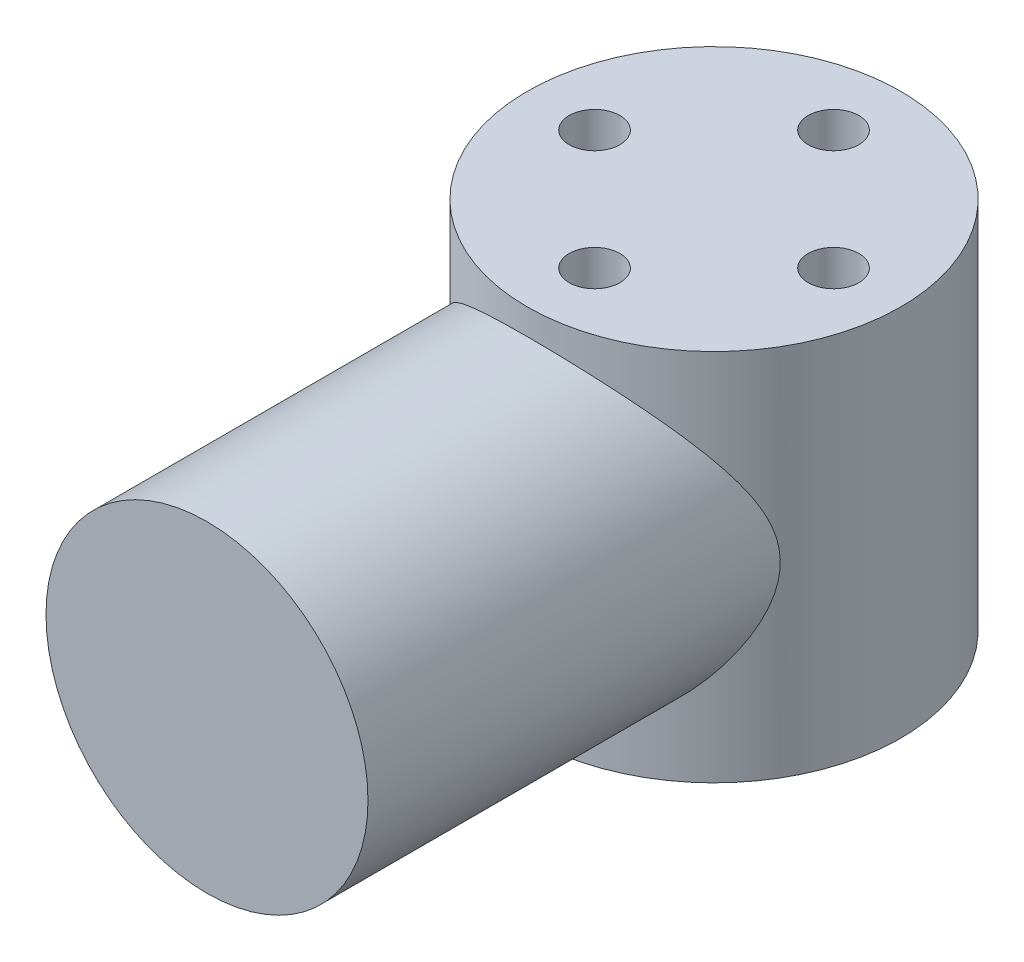
ISO-10303-21;
HEADER;
FILE_DESCRIPTION(('STEP AP214'),'2;1');
FILE_NAME('part.step','',(''),(''),'','','');
FILE_SCHEMA(('AUTOMOTIVE_DESIGN { 1 0 10303 214 1 1 1 1 }'));
ENDSEC;
DATA;
#1=APPLICATION_CONTEXT('core data for automotive mechanical design processes');
#2=APPLICATION_PROTOCOL_DEFINITION('international standard','automotive_design',2000,#1);
#3=PRODUCT_CONTEXT('',#1,'mechanical');
#4=PRODUCT('Part','Part','',(#3));
#5=PRODUCT_RELATED_PRODUCT_CATEGORY('part','',(#4));
#6=PRODUCT_DEFINITION_FORMATION('','',#4);
#7=PRODUCT_DEFINITION_CONTEXT('part definition',#1,'design');
#8=PRODUCT_DEFINITION('design','',#6,#7);
#9=PRODUCT_DEFINITION_SHAPE('','',#8);
#10=(LENGTH_UNIT() NAMED_UNIT(*) SI_UNIT(.MILLI.,.METRE.));
#11=(NAMED_UNIT(*) PLANE_ANGLE_UNIT() SI_UNIT($,.RADIAN.));
#12=(NAMED_UNIT(*) SI_UNIT($,.STERADIAN.) SOLID_ANGLE_UNIT());
#13=UNCERTAINTY_MEASURE_WITH_UNIT(LENGTH_MEASURE(1.E-05),#10,'distance_accuracy_value','');
#14=(GEOMETRIC_REPRESENTATION_CONTEXT(3) GLOBAL_UNCERTAINTY_ASSIGNED_CONTEXT((#13)) GLOBAL_UNIT_ASSIGNED_CONTEXT((#10,
#11,#12)) REPRESENTATION_CONTEXT('',''));
#15=CARTESIAN_POINT('',(0.,0.,0.));
#16=DIRECTION('',(0.,0.,1.));
#17=DIRECTION('',(1.,0.,0.));
#18=AXIS2_PLACEMENT_3D('',#15,#16,#17);
#19=CARTESIAN_POINT('',(0.,0.,0.));
#20=DIRECTION('',(0.,1.,0.));
#21=DIRECTION('',(0.,0.,1.));
#22=AXIS2_PLACEMENT_3D('',#19,#20,#21);
#23=PLANE('',#22);
#24=CARTESIAN_POINT('',(-7.07,0.,0.));
#25=DIRECTION('',(0.,-1.,0.));
#26=DIRECTION('',(0.,0.,-1.));
#27=AXIS2_PLACEMENT_3D('',#24,#25,#26);
#28=CIRCLE('',#27,1.5);
#29=CARTESIAN_POINT('',(-7.07,0.,-1.5));
#30=VERTEX_POINT('',#29);
#31=EDGE_CURVE('E80',#30,#30,#28,.T.);
#32=ORIENTED_EDGE('',*,*,#31,.F.);
#33=EDGE_LOOP('',(#32));
#34=FACE_BOUND('',#33,.T.);
#35=CARTESIAN_POINT('',(0.,0.,-7.07));
#36=DIRECTION('',(0.,-1.,0.));
#37=DIRECTION('',(0.,0.,-1.));
#38=AXIS2_PLACEMENT_3D('',#35,#36,#37);
#39=CIRCLE('',#38,1.5);
#40=CARTESIAN_POINT('',(0.,0.,-8.57));
#41=VERTEX_POINT('',#40);
#42=EDGE_CURVE('E74',#41,#41,#39,.T.);
#43=ORIENTED_EDGE('',*,*,#42,.F.);
#44=EDGE_LOOP('',(#43));
#45=FACE_BOUND('',#44,.T.);
#46=CARTESIAN_POINT('',(7.07,0.,0.));
#47=DIRECTION('',(0.,-1.,0.));
#48=DIRECTION('',(0.,0.,-1.));
#49=AXIS2_PLACEMENT_3D('',#46,#47,#48);
#50=CIRCLE('',#49,1.5);
#51=CARTESIAN_POINT('',(7.07,0.,-1.5));
#52=VERTEX_POINT('',#51);
#53=EDGE_CURVE('E68',#52,#52,#50,.T.);
#54=ORIENTED_EDGE('',*,*,#53,.F.);
#55=EDGE_LOOP('',(#54));
#56=FACE_BOUND('',#55,.T.);
#57=CARTESIAN_POINT('',(0.,0.,0.));
#58=DIRECTION('',(0.,1.,0.));
#59=DIRECTION('',(0.,0.,1.));
#60=AXIS2_PLACEMENT_3D('',#57,#58,#59);
#61=CIRCLE('',#60,11.05);
#62=CARTESIAN_POINT('',(0.,0.,11.05));
#63=VERTEX_POINT('',#62);
#64=EDGE_CURVE('E50',#63,#63,#61,.T.);
#65=ORIENTED_EDGE('',*,*,#64,.F.);
#66=EDGE_LOOP('',(#65));
#67=FACE_BOUND('',#66,.T.);
#68=CARTESIAN_POINT('',(0.,0.,7.07));
#69=DIRECTION('',(0.,-1.,0.));
#70=DIRECTION('',(0.,0.,-1.));
#71=AXIS2_PLACEMENT_3D('',#68,#69,#70);
#72=CIRCLE('',#71,1.5);
#73=CARTESIAN_POINT('',(0.,0.,5.57));
#74=VERTEX_POINT('',#73);
#75=EDGE_CURVE('E62',#74,#74,#72,.T.);
#76=ORIENTED_EDGE('',*,*,#75,.F.);
#77=EDGE_LOOP('',(#76));
#78=FACE_BOUND('',#77,.T.);
#79=ADVANCED_FACE('F34',(#34,#45,#56,#67,#78),#23,.F.);
#80=CARTESIAN_POINT('',(0.,22.1,0.));
#81=DIRECTION('',(0.,-1.,0.));
#82=DIRECTION('',(0.,0.,-1.));
#83=AXIS2_PLACEMENT_3D('',#80,#81,#82);
#84=CYLINDRICAL_SURFACE('',#83,11.05);
#85=CARTESIAN_POINT('',(0.,22.1,0.));
#86=DIRECTION('',(0.,1.,0.));
#87=DIRECTION('',(0.,0.,1.));
#88=AXIS2_PLACEMENT_3D('',#85,#86,#87);
#89=CIRCLE('',#88,11.05);
#90=CARTESIAN_POINT('',(0.,22.1,11.05));
#91=VERTEX_POINT('',#90);
#92=EDGE_CURVE('E46',#91,#91,#89,.T.);
#93=ORIENTED_EDGE('',*,*,#92,.F.);
#94=EDGE_LOOP('',(#93));
#95=FACE_BOUND('',#94,.T.);
#96=ORIENTED_EDGE('',*,*,#64,.T.);
#97=EDGE_LOOP('',(#96));
#98=FACE_BOUND('',#97,.T.);
#99=CARTESIAN_POINT('',(-9.525,11.05,5.60150649379254));
#100=CARTESIAN_POINT('',(-9.52500082992225,10.8917390470278,5.60150409965293));
#101=CARTESIAN_POINT('',(-9.52104564673195,10.7334880794927,5.60824667420914));
#102=CARTESIAN_POINT('',(-9.50534751286188,10.4184278828227,5.63481177685715));
#103=CARTESIAN_POINT('',(-9.49360133953831,10.2616192775266,5.65463971752683));
#104=CARTESIAN_POINT('',(-9.46261402986212,9.95041911217865,5.70634170250438));
#105=CARTESIAN_POINT('',(-9.44335601387433,9.79603381599038,5.73824287136157));
#106=CARTESIAN_POINT('',(-9.3977933192936,9.49085548198331,5.81256194131252));
#107=CARTESIAN_POINT('',(-9.37148565497059,9.34006399578209,5.85498429786537));
#108=CARTESIAN_POINT('',(-9.29972222791037,8.97937391081451,5.96857431348848));
#109=CARTESIAN_POINT('',(-9.25088000659741,8.7715842189055,6.0442969588614));
#110=CARTESIAN_POINT('',(-9.1410768335596,8.36470510712291,6.20910761294199));
#111=CARTESIAN_POINT('',(-9.08010908163268,8.1656206460616,6.29820311446369));
#112=CARTESIAN_POINT('',(-8.94677640987478,7.77532911465814,6.48621707521567));
#113=CARTESIAN_POINT('',(-8.87437703652419,7.58414813631466,6.58516488388485));
#114=CARTESIAN_POINT('',(-8.71894909355686,7.20986967892009,6.78962018679113));
#115=CARTESIAN_POINT('',(-8.63592127342586,7.02677163110853,6.8951272182222));
#116=CARTESIAN_POINT('',(-8.41208511200951,6.5714855758303,7.16833716537693));
#117=CARTESIAN_POINT('',(-8.26424975125251,6.30445605370261,7.33891919997118));
#118=CARTESIAN_POINT('',(-7.94487448231156,5.78720784294643,7.68354037561647));
#119=CARTESIAN_POINT('',(-7.77332264950227,5.53699770574671,7.85758121782251));
#120=CARTESIAN_POINT('',(-7.4068134674719,5.05361622826926,8.20397124457868));
#121=CARTESIAN_POINT('',(-7.21188096455849,4.82042721657019,8.37632201802829));
#122=CARTESIAN_POINT('',(-6.79837118449998,4.37161652512361,8.71527927427764));
#123=CARTESIAN_POINT('',(-6.5798040078942,4.15598740948909,8.88188817110218));
#124=CARTESIAN_POINT('',(-6.1706974177353,3.79014194955661,9.16911474595843));
#125=CARTESIAN_POINT('',(-5.98490088079444,3.63611683972918,9.29165239678784));
#126=CARTESIAN_POINT('',(-5.5990613626071,3.34057932971667,9.52912916913679));
#127=CARTESIAN_POINT('',(-5.39902142507553,3.19906427062349,9.64406990400131));
#128=CARTESIAN_POINT('',(-4.98516495711609,2.92998794024653,9.86435579513415));
#129=CARTESIAN_POINT('',(-4.77136607861964,2.80240933486306,9.9697128436078));
#130=CARTESIAN_POINT('',(-4.33030003920884,2.56253243716538,10.1690476419127));
#131=CARTESIAN_POINT('',(-4.10303552422908,2.4502311571283,10.263027616314));
#132=CARTESIAN_POINT('',(-3.67864189495731,2.26154953109252,10.4216904919105));
#133=CARTESIAN_POINT('',(-3.48358911857761,2.18235459553513,10.4885893504085));
#134=CARTESIAN_POINT('',(-3.0858818555966,2.03624302300137,10.6124070983009));
#135=CARTESIAN_POINT('',(-2.88322899374029,1.96932377954852,10.6693281061607));
#136=CARTESIAN_POINT('',(-2.47136978136362,1.84869678746144,10.7721800491683));
#137=CARTESIAN_POINT('',(-2.2621657210856,1.79498447866171,10.818114777571));
#138=CARTESIAN_POINT('',(-1.83840575187724,1.70157998928973,10.8981306068204));
#139=CARTESIAN_POINT('',(-1.62384978324048,1.66188796520412,10.932211575362));
#140=CARTESIAN_POINT('',(-1.1898342074637,1.59704827694193,10.9879431575647));
#141=CARTESIAN_POINT('',(-0.970355520703331,1.57197392321876,11.009531112447));
#142=CARTESIAN_POINT('',(-0.529282903818168,1.53714445965483,11.0395297427395));
#143=CARTESIAN_POINT('',(-0.307688969069599,1.52738938330859,11.0479403893384));
#144=CARTESIAN_POINT('',(0.135720047114833,1.52338683485834,11.0513905211319));
#145=CARTESIAN_POINT('',(0.357535103702564,1.52913778191233,11.04643136938));
#146=CARTESIAN_POINT('',(0.799521565627241,1.55603327159616,11.0232587023985));
#147=CARTESIAN_POINT('',(1.01969304690488,1.57717709850124,11.0050458034301));
#148=CARTESIAN_POINT('',(1.43921351247001,1.63217487337781,10.9577427542482));
#149=CARTESIAN_POINT('',(1.63882570459013,1.66488400564739,10.9296330784288));
#150=CARTESIAN_POINT('',(2.03396258458493,1.74252050342618,10.8630406030489));
#151=CARTESIAN_POINT('',(2.22948588552392,1.78745194456206,10.8245543433715));
#152=CARTESIAN_POINT('',(2.61525245264518,1.88889449705056,10.737878507232));
#153=CARTESIAN_POINT('',(2.80549664630178,1.94540355954411,10.689690647661));
#154=CARTESIAN_POINT('',(3.17987176939931,2.06930227830134,10.5843631487369));
#155=CARTESIAN_POINT('',(3.36400188980898,2.13669336764256,10.5272223303788));
#156=CARTESIAN_POINT('',(3.73881997776282,2.28697703663309,10.4002743944655));
#157=CARTESIAN_POINT('',(3.92898455076652,2.37064779407609,10.3298427968896));
#158=CARTESIAN_POINT('',(4.30076815129457,2.54873316978973,10.1806708598986));
#159=CARTESIAN_POINT('',(4.48238696818405,2.64314805268455,10.1019303158404));
#160=CARTESIAN_POINT('',(5.01397182266623,2.94131853524428,9.85470166003076));
#161=CARTESIAN_POINT('',(5.35066262314484,3.15999848376902,9.67520779004241));
#162=CARTESIAN_POINT('',(5.90806579701979,3.57273556607697,9.34213097233751));
#163=CARTESIAN_POINT('',(6.13694578252473,3.75963650637471,9.1930209747906));
#164=CARTESIAN_POINT('',(6.57337130631871,4.15056647259298,8.88618917095725));
#165=CARTESIAN_POINT('',(6.7809155657152,4.35459652392569,8.728466849303));
#166=CARTESIAN_POINT('',(7.17518467158073,4.77891717798995,8.40738056760533));
#167=CARTESIAN_POINT('',(7.36185656356332,4.99924688402876,8.2440035761549));
#168=CARTESIAN_POINT('',(7.71391291340288,5.45499531812166,7.91555009182902));
#169=CARTESIAN_POINT('',(7.87930361532013,5.69040958974452,7.75047411287192));
#170=CARTESIAN_POINT('',(8.1591192787582,6.12977757826188,7.45415839014378));
#171=CARTESIAN_POINT('',(8.27723581132557,6.33110806374686,7.32250010531798));
#172=CARTESIAN_POINT('',(8.49940199664156,6.74409698711759,7.06341049738091));
#173=CARTESIAN_POINT('',(8.60344900079049,6.95575735943472,6.9359799735468));
#174=CARTESIAN_POINT('',(8.79672840675064,7.38948109311502,6.68913750997265));
#175=CARTESIAN_POINT('',(8.88599837686523,7.61151617430145,6.5697057103007));
#176=CARTESIAN_POINT('',(9.04910432948081,8.06706724871361,6.34315961577832));
#177=CARTESIAN_POINT('',(9.12295129560983,8.30057492423002,6.23603657975854));
#178=CARTESIAN_POINT('',(9.26458807367773,8.81921611144972,6.02401099148289));
#179=CARTESIAN_POINT('',(9.3294255180389,9.10655811892461,5.92232024231833));
#180=CARTESIAN_POINT('',(9.40709616043564,9.54849430749301,5.79753947904712));
#181=CARTESIAN_POINT('',(9.42971288312415,9.69751587597139,5.76058839734621));
#182=CARTESIAN_POINT('',(9.46801536063946,9.99866065786182,5.6974161084725));
#183=CARTESIAN_POINT('',(9.48370481741836,10.1507821690712,5.67118917083941));
#184=CARTESIAN_POINT('',(9.50791699017786,10.4589815576076,5.63050545556141));
#185=CARTESIAN_POINT('',(9.51635470739001,10.6150848451597,5.61618833552466));
#186=CARTESIAN_POINT('',(9.52550795517872,10.9281689461673,5.60065018561227));
#187=CARTESIAN_POINT('',(9.52622403552266,11.0851496963527,5.59942822338377));
#188=CARTESIAN_POINT('',(9.51991058631052,11.3985897694906,5.6101549965467));
#189=CARTESIAN_POINT('',(9.51287647860256,11.5550487294267,5.62211151666607));
#190=CARTESIAN_POINT('',(9.4912652243683,11.8659728974857,5.65851781695896));
#191=CARTESIAN_POINT('',(9.47668684581537,12.0204377757384,5.68296963768506));
#192=CARTESIAN_POINT('',(9.43735931848805,12.3515668548503,5.74807975813047));
#193=CARTESIAN_POINT('',(9.41132740811473,12.5276806699505,5.79074867413336));
#194=CARTESIAN_POINT('',(9.35023644849697,12.8747762521295,5.88887981575393));
#195=CARTESIAN_POINT('',(9.31517008454354,13.0457537347583,5.9443524040059));
#196=CARTESIAN_POINT('',(9.23660855607515,13.3825264747122,6.06570626597809));
#197=CARTESIAN_POINT('',(9.19308889468457,13.5483050039082,6.13161768541814));
#198=CARTESIAN_POINT('',(9.09829533421998,13.8740782025597,6.2714167419841));
#199=CARTESIAN_POINT('',(9.04702319369943,14.0340741735445,6.34530256912976));
#200=CARTESIAN_POINT('',(8.89904404160978,14.4576852160354,6.55248354789958));
#201=CARTESIAN_POINT('',(8.79549729714374,14.7161633622437,6.69142678962505));
#202=CARTESIAN_POINT('',(8.56881955872325,15.2185670196758,6.97936324817141));
#203=CARTESIAN_POINT('',(8.44567552900802,15.4624826946399,7.12836311621717));
#204=CARTESIAN_POINT('',(8.18029902419143,15.9369511707047,7.43140921274444));
#205=CARTESIAN_POINT('',(8.038040388135,16.167485026534,7.5854621346528));
#206=CARTESIAN_POINT('',(7.73482415409624,16.6151758847243,7.89441978137763));
#207=CARTESIAN_POINT('',(7.57387100913809,16.8323360539098,8.04932429500438));
#208=CARTESIAN_POINT('',(7.22344407294044,17.2652556027718,8.36559695350549));
#209=CARTESIAN_POINT('',(7.03286525760935,17.4802236786996,8.52682770989705));
#210=CARTESIAN_POINT('',(6.63053903065298,17.8943340635102,8.84330134175609));
#211=CARTESIAN_POINT('',(6.4187875986846,18.0934733538236,8.99854307221766));
#212=CARTESIAN_POINT('',(5.97458272213769,18.4739684576958,9.29939048383801));
#213=CARTESIAN_POINT('',(5.74217844991883,18.6553644601518,9.44501768668605));
#214=CARTESIAN_POINT('',(5.25649140819952,18.9987913004311,9.72368757511301));
#215=CARTESIAN_POINT('',(5.00321824112573,19.1608309615526,9.85673598873215));
#216=CARTESIAN_POINT('',(4.55372968474558,19.4187063643257,10.0701809860871));
#217=CARTESIAN_POINT('',(4.36254124146301,19.5200283995335,10.1545820319395));
#218=CARTESIAN_POINT('',(3.9705940324177,19.7106854361337,10.3141467151272));
#219=CARTESIAN_POINT('',(3.76983777451196,19.8000235555114,10.3893127548043));
#220=CARTESIAN_POINT('',(3.35953705073539,19.9656073308615,10.5291483408766));
#221=CARTESIAN_POINT('',(3.14999596237639,20.0418579621852,10.5938218755975));
#222=CARTESIAN_POINT('',(2.72307804775501,20.1802142612462,10.7115061357532));
#223=CARTESIAN_POINT('',(2.50570104602359,20.2423196120012,10.7645165998288));
#224=CARTESIAN_POINT('',(2.06281446419282,20.3517650856477,10.8581259016933));
#225=CARTESIAN_POINT('',(1.83725607212198,20.3989908305636,10.8986285481615));
#226=CARTESIAN_POINT('',(1.38128122774469,20.4771514156348,10.9657492762703));
#227=CARTESIAN_POINT('',(1.15086477563059,20.5080862564352,10.9923673584607));
#228=CARTESIAN_POINT('',(0.687274022204181,20.5530251513086,11.0310575757989));
#229=CARTESIAN_POINT('',(0.454101033490599,20.5670369598579,11.0431363731328));
#230=CARTESIAN_POINT('',(-0.0129290153272883,20.5778538839658,11.0524597322759));
#231=CARTESIAN_POINT('',(-0.246786005873986,20.5746606922273,11.0497057533982));
#232=CARTESIAN_POINT('',(-0.686388154917254,20.552488002026,11.0305996380127));
#233=CARTESIAN_POINT('',(-0.892299578204402,20.5353491685214,11.0158330749591));
#234=CARTESIAN_POINT('',(-1.3014726683711,20.4879133231882,10.9750141877133));
#235=CARTESIAN_POINT('',(-1.50473428948882,20.4576160844244,10.9489616688791));
#236=CARTESIAN_POINT('',(-1.90725039388745,20.3843384701766,10.8860643336448));
#237=CARTESIAN_POINT('',(-2.10650481764677,20.3413579064471,10.8492193570635));
#238=CARTESIAN_POINT('',(-2.4998408926081,20.243340608776,10.7653955874318));
#239=CARTESIAN_POINT('',(-2.6939222790612,20.1883032591087,10.7184162768349));
#240=CARTESIAN_POINT('',(-3.0798007669353,20.0656670566356,10.6140504750287));
#241=CARTESIAN_POINT('',(-3.27147263087037,19.9978370190318,10.5564730106221));
#242=CARTESIAN_POINT('',(-3.64764351341561,19.8512004708586,10.4324724565484));
#243=CARTESIAN_POINT('',(-3.8321398994441,19.7723899794138,10.3660461591928));
#244=CARTESIAN_POINT('',(-4.37388216502155,19.5207227737467,10.1548815853909));
#245=CARTESIAN_POINT('',(-4.71957888290053,19.3325662908908,9.99820268857616));
#246=CARTESIAN_POINT('',(-5.29015493121157,18.9760095743692,9.70520983457484));
#247=CARTESIAN_POINT('',(-5.52291437834581,18.8154064215821,9.5743602856306));
#248=CARTESIAN_POINT('',(-5.9696840201317,18.4774432784094,9.30234975587588));
#249=CARTESIAN_POINT('',(-6.18368652349593,18.30007647547,9.1611845882493));
#250=CARTESIAN_POINT('',(-6.59326305438279,17.9297522689404,8.87099664861123));
#251=CARTESIAN_POINT('',(-6.78878359545187,17.7367524468636,8.72195290683325));
#252=CARTESIAN_POINT('',(-7.1608139947255,17.3367292397973,8.41918845202123));
#253=CARTESIAN_POINT('',(-7.33732680466753,17.1297080403644,8.26546846993591));
#254=CARTESIAN_POINT('',(-7.67484998393912,16.6979122828606,7.95318030983806));
#255=CARTESIAN_POINT('',(-7.83547823592434,16.4728648529015,7.79457674085875));
#256=CARTESIAN_POINT('',(-8.1371676077228,16.0087094396268,7.47907982095724));
#257=CARTESIAN_POINT('',(-8.27822116789824,15.7695960746047,7.32218715220905));
#258=CARTESIAN_POINT('',(-8.54008354241209,15.2773099313787,7.01498924584837));
#259=CARTESIAN_POINT('',(-8.6609366964155,15.0241696140483,6.86467012989713));
#260=CARTESIAN_POINT('',(-8.88178703907156,14.502494768798,6.57641777302496));
#261=CARTESIAN_POINT('',(-8.98180399814129,14.2339751448844,6.43847286228053));
#262=CARTESIAN_POINT('',(-9.16481739058276,13.6628277384282,6.17541689642815));
#263=CARTESIAN_POINT('',(-9.2464113962092,13.3591189088324,6.05159389441295));
#264=CARTESIAN_POINT('',(-9.34695787235538,12.8899666028899,5.89413324183307));
#265=CARTESIAN_POINT('',(-9.37680628760553,12.7315466484449,5.84640534240072));
#266=CARTESIAN_POINT('',(-9.42873515794241,12.4105103802135,5.76228153260842));
#267=CARTESIAN_POINT('',(-9.4508198705526,12.2478964190553,5.72587941258699));
#268=CARTESIAN_POINT('',(-9.48728450667645,11.9138339369204,5.66526650024427));
#269=CARTESIAN_POINT('',(-9.50138250788541,11.7422717352478,5.64150342024643));
#270=CARTESIAN_POINT('',(-9.52024023963553,11.3971358112379,5.60962399230036));
#271=CARTESIAN_POINT('',(-9.52499908983941,11.223561900822,5.60150911940179));
#272=CARTESIAN_POINT('',(-9.525,11.05,5.60150649379254));
#273=B_SPLINE_CURVE_WITH_KNOTS('',3,(#99,#100,#101,#102,#103,#104,#105,#106,#107,#108,#109,#110,
#111,#112,#113,#114,#115,#116,#117,#118,#119,#120,#121,#122,#123,#124,#125,#126,#127,#128,#129,
#130,#131,#132,#133,#134,#135,#136,#137,#138,#139,#140,#141,#142,#143,#144,#145,#146,#147,#148,
#149,#150,#151,#152,#153,#154,#155,#156,#157,#158,#159,#160,#161,#162,#163,#164,#165,#166,#167,
#168,#169,#170,#171,#172,#173,#174,#175,#176,#177,#178,#179,#180,#181,#182,#183,#184,#185,#186,
#187,#188,#189,#190,#191,#192,#193,#194,#195,#196,#197,#198,#199,#200,#201,#202,#203,#204,#205,
#206,#207,#208,#209,#210,#211,#212,#213,#214,#215,#216,#217,#218,#219,#220,#221,#222,#223,#224,
#225,#226,#227,#228,#229,#230,#231,#232,#233,#234,#235,#236,#237,#238,#239,#240,#241,#242,#243,
#244,#245,#246,#247,#248,#249,#250,#251,#252,#253,#254,#255,#256,#257,#258,#259,#260,#261,#262,
#263,#264,#265,#266,#267,#268,#269,#270,#271,#272),.UNSPECIFIED.,.T.,.F.,(4,2,2,2,2,2,2,2,2,2,2,
2,2,2,2,2,2,2,2,2,2,2,2,2,2,2,2,2,2,2,2,2,2,2,2,2,2,2,2,2,2,2,2,2,2,2,2,2,2,2,2,2,2,2,2,2,2,2,2,
2,2,2,2,2,2,2,2,2,2,2,2,2,2,2,2,2,2,2,2,2,2,2,2,2,2,2,4),(0.,0.47457877871975,0.949353983425788,
1.4252022447518,1.90125236098996,2.57957356885943,3.25827626888177,3.9390649770443,
4.61980570447575,5.66736599422782,6.71545492527139,7.76243977412516,8.8089789376585,
9.62028266904163,10.4314135478269,11.241523773949,12.0514753417319,12.7135077548046,
13.3753994365621,14.0370622546458,14.6987324576091,15.3636931349266,16.0286552661315,
16.6935496068852,17.3584130339341,17.9703897539654,18.5825707932187,19.194643589947,
19.8067970576959,20.4642610826326,21.1217413041923,22.4367140300934,23.42852429891,
24.4203939835654,25.4147255869983,26.4087647775996,27.2121958359111,28.0157779308108,
28.8172845771574,29.6182184623262,30.5497845987189,31.0148995405388,31.4797656217727,
31.9500089262143,32.4202187499139,32.8907064825703,33.3612710730744,33.9096089294172,
34.4583921481619,35.0087900777855,35.5590633432716,36.4911740412573,37.4239073741941,
38.3579305366004,39.291731669601,40.2789698935083,41.2663959355404,42.2515309688555,
43.2362152155254,43.9323694451963,44.6283421961056,45.3240497765226,46.0197729455576,
46.7207204799996,47.4216679866883,48.1222941830276,48.8228514499661,49.443565242236,
50.0642897400099,50.6850234510198,51.3057888695614,51.9390877376559,52.5726168035116,
53.8390359980736,54.7727328358896,55.7068107623388,56.6435140497214,57.5800716647144,
58.535421145306,59.491138555907,60.4447298163835,61.3974120990191,62.4079473596953,
62.9118198391104,63.4154155681384,63.9358284062062,64.4562902976422),.UNSPECIFIED.);
#274=CARTESIAN_POINT('',(-9.525,11.05,5.60150649379254));
#275=VERTEX_POINT('',#274);
#276=EDGE_CURVE('E10',#275,#275,#273,.T.);
#277=ORIENTED_EDGE('',*,*,#276,.F.);
#278=EDGE_LOOP('',(#277));
#279=FACE_BOUND('',#278,.T.);
#280=ADVANCED_FACE('F36',(#95,#98,#279),#84,.T.);
#281=CARTESIAN_POINT('',(0.,22.1,0.));
#282=DIRECTION('',(0.,1.,0.));
#283=DIRECTION('',(0.,0.,1.));
#284=AXIS2_PLACEMENT_3D('',#281,#282,#283);
#285=PLANE('',#284);
#286=CARTESIAN_POINT('',(-7.07,22.1,0.));
#287=DIRECTION('',(0.,-1.,0.));
#288=DIRECTION('',(0.,0.,-1.));
#289=AXIS2_PLACEMENT_3D('',#286,#287,#288);
#290=CIRCLE('',#289,1.49999999999999);
#291=CARTESIAN_POINT('',(-7.07,22.1,-1.49999999999999));
#292=VERTEX_POINT('',#291);
#293=EDGE_CURVE('E77',#292,#292,#290,.T.);
#294=ORIENTED_EDGE('',*,*,#293,.T.);
#295=EDGE_LOOP('',(#294));
#296=FACE_BOUND('',#295,.T.);
#297=CARTESIAN_POINT('',(0.,22.1,-7.07));
#298=DIRECTION('',(0.,-1.,0.));
#299=DIRECTION('',(0.,0.,-1.));
#300=AXIS2_PLACEMENT_3D('',#297,#298,#299);
#301=CIRCLE('',#300,1.49999999999999);
#302=CARTESIAN_POINT('',(0.,22.1,-8.56999999999999));
#303=VERTEX_POINT('',#302);
#304=EDGE_CURVE('E71',#303,#303,#301,.T.);
#305=ORIENTED_EDGE('',*,*,#304,.T.);
#306=EDGE_LOOP('',(#305));
#307=FACE_BOUND('',#306,.T.);
#308=CARTESIAN_POINT('',(7.07,22.1,0.));
#309=DIRECTION('',(0.,-1.,0.));
#310=DIRECTION('',(0.,0.,-1.));
#311=AXIS2_PLACEMENT_3D('',#308,#309,#310);
#312=CIRCLE('',#311,1.49999999999999);
#313=CARTESIAN_POINT('',(7.07,22.1,-1.49999999999999));
#314=VERTEX_POINT('',#313);
#315=EDGE_CURVE('E65',#314,#314,#312,.T.);
#316=ORIENTED_EDGE('',*,*,#315,.T.);
#317=EDGE_LOOP('',(#316));
#318=FACE_BOUND('',#317,.T.);
#319=CARTESIAN_POINT('',(0.,22.1,7.07));
#320=DIRECTION('',(0.,-1.,0.));
#321=DIRECTION('',(0.,0.,-1.));
#322=AXIS2_PLACEMENT_3D('',#319,#320,#321);
#323=CIRCLE('',#322,1.49999999999999);
#324=CARTESIAN_POINT('',(0.,22.1,5.57000000000001));
#325=VERTEX_POINT('',#324);
#326=EDGE_CURVE('E59',#325,#325,#323,.T.);
#327=ORIENTED_EDGE('',*,*,#326,.T.);
#328=EDGE_LOOP('',(#327));
#329=FACE_BOUND('',#328,.T.);
#330=ORIENTED_EDGE('',*,*,#92,.T.);
#331=EDGE_LOOP('',(#330));
#332=FACE_BOUND('',#331,.T.);
#333=ADVANCED_FACE('F117',(#296,#307,#318,#329,#332),#285,.T.);
#334=CARTESIAN_POINT('',(0.,11.05,30.));
#335=DIRECTION('',(0.,0.,-1.));
#336=DIRECTION('',(-1.,0.,0.));
#337=AXIS2_PLACEMENT_3D('',#334,#335,#336);
#338=CYLINDRICAL_SURFACE('',#337,9.525);
#339=CARTESIAN_POINT('',(0.,11.05,30.));
#340=DIRECTION('',(0.,0.,1.));
#341=DIRECTION('',(1.,0.,0.));
#342=AXIS2_PLACEMENT_3D('',#339,#340,#341);
#343=CIRCLE('',#342,9.525);
#344=CARTESIAN_POINT('',(9.525,11.05,30.));
#345=VERTEX_POINT('',#344);
#346=EDGE_CURVE('E55',#345,#345,#343,.T.);
#347=ORIENTED_EDGE('',*,*,#346,.F.);
#348=EDGE_LOOP('',(#347));
#349=FACE_BOUND('',#348,.T.);
#350=ORIENTED_EDGE('',*,*,#276,.T.);
#351=EDGE_LOOP('',(#350));
#352=FACE_BOUND('',#351,.T.);
#353=ADVANCED_FACE('F109',(#349,#352),#338,.T.);
#354=CARTESIAN_POINT('',(0.,11.05,30.));
#355=DIRECTION('',(0.,0.,1.));
#356=DIRECTION('',(1.,0.,0.));
#357=AXIS2_PLACEMENT_3D('',#354,#355,#356);
#358=PLANE('',#357);
#359=ORIENTED_EDGE('',*,*,#346,.T.);
#360=EDGE_LOOP('',(#359));
#361=FACE_BOUND('',#360,.T.);
#362=ADVANCED_FACE('F99',(#361),#358,.T.);
#363=CARTESIAN_POINT('',(0.,0.,7.07));
#364=DIRECTION('',(0.,-1.,0.));
#365=DIRECTION('',(0.,0.,-1.));
#366=AXIS2_PLACEMENT_3D('',#363,#364,#365);
#367=CYLINDRICAL_SURFACE('',#366,1.5);
#368=ORIENTED_EDGE('',*,*,#326,.F.);
#369=EDGE_LOOP('',(#368));
#370=FACE_BOUND('',#369,.T.);
#371=ORIENTED_EDGE('',*,*,#75,.T.);
#372=EDGE_LOOP('',(#371));
#373=FACE_BOUND('',#372,.T.);
#374=ADVANCED_FACE('F96',(#370,#373),#367,.F.);
#375=CARTESIAN_POINT('',(7.07,0.,0.));
#376=DIRECTION('',(0.,-1.,0.));
#377=DIRECTION('',(0.,0.,-1.));
#378=AXIS2_PLACEMENT_3D('',#375,#376,#377);
#379=CYLINDRICAL_SURFACE('',#378,1.5);
#380=ORIENTED_EDGE('',*,*,#315,.F.);
#381=EDGE_LOOP('',(#380));
#382=FACE_BOUND('',#381,.T.);
#383=ORIENTED_EDGE('',*,*,#53,.T.);
#384=EDGE_LOOP('',(#383));
#385=FACE_BOUND('',#384,.T.);
#386=ADVANCED_FACE('F98',(#382,#385),#379,.F.);
#387=CARTESIAN_POINT('',(0.,0.,-7.07));
#388=DIRECTION('',(0.,-1.,0.));
#389=DIRECTION('',(0.,0.,-1.));
#390=AXIS2_PLACEMENT_3D('',#387,#388,#389);
#391=CYLINDRICAL_SURFACE('',#390,1.5);
#392=ORIENTED_EDGE('',*,*,#304,.F.);
#393=EDGE_LOOP('',(#392));
#394=FACE_BOUND('',#393,.T.);
#395=ORIENTED_EDGE('',*,*,#42,.T.);
#396=EDGE_LOOP('',(#395));
#397=FACE_BOUND('',#396,.T.);
#398=ADVANCED_FACE('F106',(#394,#397),#391,.F.);
#399=CARTESIAN_POINT('',(-7.07,0.,0.));
#400=DIRECTION('',(0.,-1.,0.));
#401=DIRECTION('',(0.,0.,-1.));
#402=AXIS2_PLACEMENT_3D('',#399,#400,#401);
#403=CYLINDRICAL_SURFACE('',#402,1.5);
#404=ORIENTED_EDGE('',*,*,#293,.F.);
#405=EDGE_LOOP('',(#404));
#406=FACE_BOUND('',#405,.T.);
#407=ORIENTED_EDGE('',*,*,#31,.T.);
#408=EDGE_LOOP('',(#407));
#409=FACE_BOUND('',#408,.T.);
#410=ADVANCED_FACE('F84',(#406,#409),#403,.F.);
#411=CLOSED_SHELL('',(#79,#280,#333,#353,#362,#374,#386,#398,#410));
#412=MANIFOLD_SOLID_BREP('B2',#411);
#413=ADVANCED_BREP_SHAPE_REPRESENTATION('',(#18,#412),#14);
#414=SHAPE_DEFINITION_REPRESENTATION(#9,#413);
ENDSEC;
END-ISO-10303-21;
